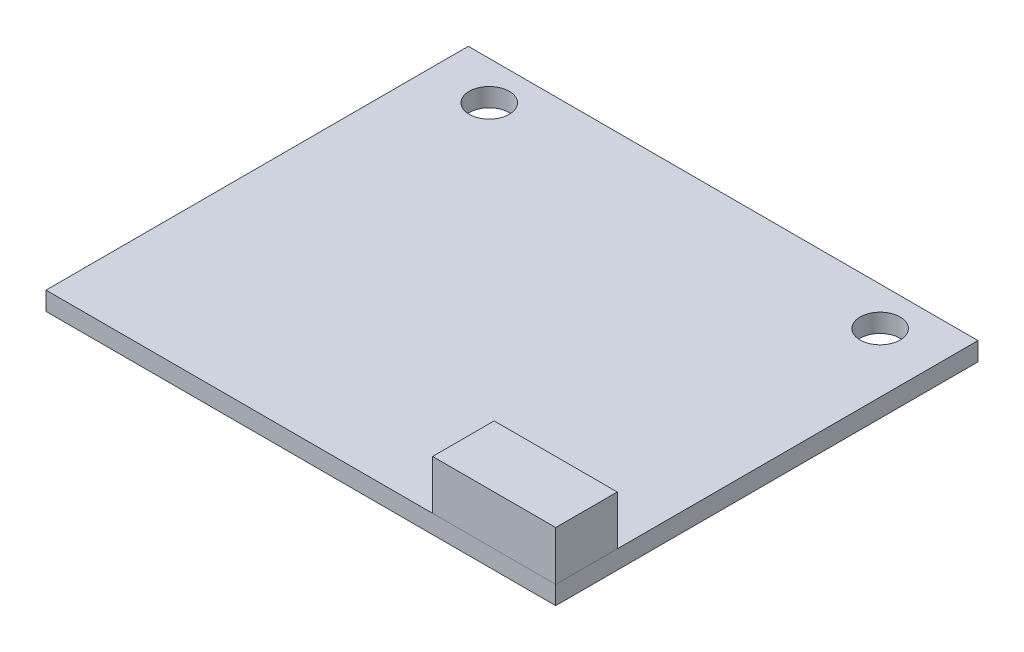
ISO-10303-21;
HEADER;
FILE_DESCRIPTION(('STEP AP214'),'2;1');
FILE_NAME('part.step','',(''),(''),'','','');
FILE_SCHEMA(('AUTOMOTIVE_DESIGN { 1 0 10303 214 1 1 1 1 }'));
ENDSEC;
DATA;
#1=APPLICATION_CONTEXT('core data for automotive mechanical design processes');
#2=APPLICATION_PROTOCOL_DEFINITION('international standard','automotive_design',2000,#1);
#3=PRODUCT_CONTEXT('',#1,'mechanical');
#4=PRODUCT('Part','Part','',(#3));
#5=PRODUCT_RELATED_PRODUCT_CATEGORY('part','',(#4));
#6=PRODUCT_DEFINITION_FORMATION('','',#4);
#7=PRODUCT_DEFINITION_CONTEXT('part definition',#1,'design');
#8=PRODUCT_DEFINITION('design','',#6,#7);
#9=PRODUCT_DEFINITION_SHAPE('','',#8);
#10=(LENGTH_UNIT() NAMED_UNIT(*) SI_UNIT(.MILLI.,.METRE.));
#11=(NAMED_UNIT(*) PLANE_ANGLE_UNIT() SI_UNIT($,.RADIAN.));
#12=(NAMED_UNIT(*) SI_UNIT($,.STERADIAN.) SOLID_ANGLE_UNIT());
#13=UNCERTAINTY_MEASURE_WITH_UNIT(LENGTH_MEASURE(1.E-05),#10,'distance_accuracy_value','');
#14=(GEOMETRIC_REPRESENTATION_CONTEXT(3) GLOBAL_UNCERTAINTY_ASSIGNED_CONTEXT((#13)) GLOBAL_UNIT_ASSIGNED_CONTEXT((#10,
#11,#12)) REPRESENTATION_CONTEXT('',''));
#15=CARTESIAN_POINT('',(0.,0.,0.));
#16=DIRECTION('',(0.,0.,1.));
#17=DIRECTION('',(1.,0.,0.));
#18=AXIS2_PLACEMENT_3D('',#15,#16,#17);
#19=CARTESIAN_POINT('',(20.7,5.5,17.15));
#20=DIRECTION('',(-1.,0.,0.));
#21=DIRECTION('',(0.,0.,1.));
#22=AXIS2_PLACEMENT_3D('',#19,#20,#21);
#23=PLANE('',#22);
#24=DIRECTION('',(0.,0.,-1.));
#25=VECTOR('',#24,1.);
#26=CARTESIAN_POINT('',(20.7,1.5,17.15));
#27=LINE('',#26,#25);
#28=CARTESIAN_POINT('',(20.7,1.5,17.15));
#29=VERTEX_POINT('',#28);
#30=CARTESIAN_POINT('',(20.7,1.5,12.15));
#31=VERTEX_POINT('',#30);
#32=EDGE_CURVE('E119',#29,#31,#27,.T.);
#33=ORIENTED_EDGE('',*,*,#32,.T.);
#34=DIRECTION('',(0.,-1.,0.));
#35=VECTOR('',#34,1.);
#36=CARTESIAN_POINT('',(20.7,5.5,12.15));
#37=LINE('',#36,#35);
#38=CARTESIAN_POINT('',(20.7,5.5,12.15));
#39=VERTEX_POINT('',#38);
#40=EDGE_CURVE('E12',#39,#31,#37,.T.);
#41=ORIENTED_EDGE('',*,*,#40,.F.);
#42=DIRECTION('',(0.,0.,-1.));
#43=VECTOR('',#42,1.);
#44=CARTESIAN_POINT('',(20.7,5.5,17.15));
#45=LINE('',#44,#43);
#46=CARTESIAN_POINT('',(20.7,5.5,17.15));
#47=VERTEX_POINT('',#46);
#48=EDGE_CURVE('E106',#47,#39,#45,.T.);
#49=ORIENTED_EDGE('',*,*,#48,.F.);
#50=DIRECTION('',(0.,-1.,0.));
#51=VECTOR('',#50,1.);
#52=CARTESIAN_POINT('',(20.7,5.5,17.15));
#53=LINE('',#52,#51);
#54=EDGE_CURVE('E111',#47,#29,#53,.T.);
#55=ORIENTED_EDGE('',*,*,#54,.T.);
#56=EDGE_LOOP('',(#33,#41,#49,#55));
#57=FACE_BOUND('',#56,.T.);
#58=ADVANCED_FACE('F54',(#57),#23,.F.);
#59=CARTESIAN_POINT('',(20.7,5.5,12.15));
#60=DIRECTION('',(0.,0.,1.));
#61=DIRECTION('',(1.,0.,0.));
#62=AXIS2_PLACEMENT_3D('',#59,#60,#61);
#63=PLANE('',#62);
#64=DIRECTION('',(-1.,0.,0.));
#65=VECTOR('',#64,1.);
#66=CARTESIAN_POINT('',(20.7,1.5,12.15));
#67=LINE('',#66,#65);
#68=CARTESIAN_POINT('',(10.7,1.5,12.15));
#69=VERTEX_POINT('',#68);
#70=EDGE_CURVE('E109',#31,#69,#67,.T.);
#71=ORIENTED_EDGE('',*,*,#70,.T.);
#72=DIRECTION('',(0.,-1.,0.));
#73=VECTOR('',#72,1.);
#74=CARTESIAN_POINT('',(10.7,5.5,12.15));
#75=LINE('',#74,#73);
#76=CARTESIAN_POINT('',(10.7,5.5,12.15));
#77=VERTEX_POINT('',#76);
#78=EDGE_CURVE('E64',#77,#69,#75,.T.);
#79=ORIENTED_EDGE('',*,*,#78,.F.);
#80=DIRECTION('',(-1.,0.,0.));
#81=VECTOR('',#80,1.);
#82=CARTESIAN_POINT('',(20.7,5.5,12.15));
#83=LINE('',#82,#81);
#84=EDGE_CURVE('E101',#39,#77,#83,.T.);
#85=ORIENTED_EDGE('',*,*,#84,.F.);
#86=ORIENTED_EDGE('',*,*,#40,.T.);
#87=EDGE_LOOP('',(#71,#79,#85,#86));
#88=FACE_BOUND('',#87,.T.);
#89=ADVANCED_FACE('F108',(#88),#63,.F.);
#90=CARTESIAN_POINT('',(10.7,5.5,17.15));
#91=DIRECTION('',(1.,0.,0.));
#92=DIRECTION('',(0.,0.,-1.));
#93=AXIS2_PLACEMENT_3D('',#90,#91,#92);
#94=PLANE('',#93);
#95=DIRECTION('',(0.,0.,1.));
#96=VECTOR('',#95,1.);
#97=CARTESIAN_POINT('',(10.7,1.5,17.15));
#98=LINE('',#97,#96);
#99=CARTESIAN_POINT('',(10.7,1.5,17.15));
#100=VERTEX_POINT('',#99);
#101=EDGE_CURVE('E86',#69,#100,#98,.T.);
#102=ORIENTED_EDGE('',*,*,#101,.T.);
#103=DIRECTION('',(0.,-1.,0.));
#104=VECTOR('',#103,1.);
#105=CARTESIAN_POINT('',(10.7,5.5,17.15));
#106=LINE('',#105,#104);
#107=CARTESIAN_POINT('',(10.7,5.5,17.15));
#108=VERTEX_POINT('',#107);
#109=EDGE_CURVE('E112',#108,#100,#106,.T.);
#110=ORIENTED_EDGE('',*,*,#109,.F.);
#111=DIRECTION('',(0.,0.,1.));
#112=VECTOR('',#111,1.);
#113=CARTESIAN_POINT('',(10.7,5.5,17.15));
#114=LINE('',#113,#112);
#115=EDGE_CURVE('E102',#77,#108,#114,.T.);
#116=ORIENTED_EDGE('',*,*,#115,.F.);
#117=ORIENTED_EDGE('',*,*,#78,.T.);
#118=EDGE_LOOP('',(#102,#110,#116,#117));
#119=FACE_BOUND('',#118,.T.);
#120=ADVANCED_FACE('F115',(#119),#94,.F.);
#121=CARTESIAN_POINT('',(20.7,5.5,17.15));
#122=DIRECTION('',(0.,0.,-1.));
#123=DIRECTION('',(-1.,0.,0.));
#124=AXIS2_PLACEMENT_3D('',#121,#122,#123);
#125=PLANE('',#124);
#126=DIRECTION('',(1.,0.,0.));
#127=VECTOR('',#126,1.);
#128=CARTESIAN_POINT('',(20.7,1.5,17.15));
#129=LINE('',#128,#127);
#130=EDGE_CURVE('E94',#100,#29,#129,.T.);
#131=ORIENTED_EDGE('',*,*,#130,.T.);
#132=ORIENTED_EDGE('',*,*,#54,.F.);
#133=DIRECTION('',(1.,0.,0.));
#134=VECTOR('',#133,1.);
#135=CARTESIAN_POINT('',(20.7,5.5,17.15));
#136=LINE('',#135,#134);
#137=EDGE_CURVE('E72',#108,#47,#136,.T.);
#138=ORIENTED_EDGE('',*,*,#137,.F.);
#139=ORIENTED_EDGE('',*,*,#109,.T.);
#140=EDGE_LOOP('',(#131,#132,#138,#139));
#141=FACE_BOUND('',#140,.T.);
#142=ADVANCED_FACE('F122',(#141),#125,.F.);
#143=CARTESIAN_POINT('',(0.,5.5,0.));
#144=DIRECTION('',(0.,1.,0.));
#145=DIRECTION('',(0.,0.,1.));
#146=AXIS2_PLACEMENT_3D('',#143,#144,#145);
#147=PLANE('',#146);
#148=ORIENTED_EDGE('',*,*,#48,.T.);
#149=ORIENTED_EDGE('',*,*,#84,.T.);
#150=ORIENTED_EDGE('',*,*,#115,.T.);
#151=ORIENTED_EDGE('',*,*,#137,.T.);
#152=EDGE_LOOP('',(#148,#149,#150,#151));
#153=FACE_BOUND('',#152,.T.);
#154=ADVANCED_FACE('F105',(#153),#147,.T.);
#155=CARTESIAN_POINT('',(0.,1.5,0.));
#156=DIRECTION('',(0.,1.,0.));
#157=DIRECTION('',(0.,0.,1.));
#158=AXIS2_PLACEMENT_3D('',#155,#156,#157);
#159=PLANE('',#158);
#160=ORIENTED_EDGE('',*,*,#32,.F.);
#161=ORIENTED_EDGE('',*,*,#130,.F.);
#162=ORIENTED_EDGE('',*,*,#101,.F.);
#163=ORIENTED_EDGE('',*,*,#70,.F.);
#164=EDGE_LOOP('',(#160,#161,#162,#163));
#165=FACE_BOUND('',#164,.T.);
#166=ADVANCED_FACE('F126',(#165),#159,.F.);
#167=CLOSED_SHELL('',(#58,#89,#120,#142,#154,#166));
#168=MANIFOLD_SOLID_BREP('B2',#167);
#169=CARTESIAN_POINT('',(0.,1.5,0.));
#170=DIRECTION('',(0.,1.,0.));
#171=DIRECTION('',(0.,0.,1.));
#172=AXIS2_PLACEMENT_3D('',#169,#170,#171);
#173=PLANE('',#172);
#174=CARTESIAN_POINT('',(-15.875,1.5,-14.025));
#175=DIRECTION('',(0.,1.,0.));
#176=DIRECTION('',(0.,0.,1.));
#177=AXIS2_PLACEMENT_3D('',#174,#175,#176);
#178=CIRCLE('',#177,1.625);
#179=CARTESIAN_POINT('',(-15.875,1.5,-12.4));
#180=VERTEX_POINT('',#179);
#181=EDGE_CURVE('E261',#180,#180,#178,.T.);
#182=ORIENTED_EDGE('',*,*,#181,.F.);
#183=EDGE_LOOP('',(#182));
#184=FACE_BOUND('',#183,.T.);
#185=DIRECTION('',(0.,0.,1.));
#186=VECTOR('',#185,1.);
#187=CARTESIAN_POINT('',(-20.7,1.5,-17.15));
#188=LINE('',#187,#186);
#189=CARTESIAN_POINT('',(-20.7,1.5,-17.15));
#190=VERTEX_POINT('',#189);
#191=CARTESIAN_POINT('',(-20.7,1.5,17.15));
#192=VERTEX_POINT('',#191);
#193=EDGE_CURVE('E238',#190,#192,#188,.T.);
#194=ORIENTED_EDGE('',*,*,#193,.T.);
#195=DIRECTION('',(1.,0.,0.));
#196=VECTOR('',#195,1.);
#197=CARTESIAN_POINT('',(-20.7,1.5,17.15));
#198=LINE('',#197,#196);
#199=CARTESIAN_POINT('',(20.7,1.5,17.15));
#200=VERTEX_POINT('',#199);
#201=EDGE_CURVE('E232',#192,#200,#198,.T.);
#202=ORIENTED_EDGE('',*,*,#201,.T.);
#203=DIRECTION('',(0.,0.,-1.));
#204=VECTOR('',#203,1.);
#205=CARTESIAN_POINT('',(20.7,1.5,-17.15));
#206=LINE('',#205,#204);
#207=CARTESIAN_POINT('',(20.7,1.5,-17.15));
#208=VERTEX_POINT('',#207);
#209=EDGE_CURVE('E236',#200,#208,#206,.T.);
#210=ORIENTED_EDGE('',*,*,#209,.T.);
#211=DIRECTION('',(-1.,0.,0.));
#212=VECTOR('',#211,1.);
#213=CARTESIAN_POINT('',(-20.7,1.5,-17.15));
#214=LINE('',#213,#212);
#215=EDGE_CURVE('E199',#208,#190,#214,.T.);
#216=ORIENTED_EDGE('',*,*,#215,.T.);
#217=EDGE_LOOP('',(#194,#202,#210,#216));
#218=FACE_BOUND('',#217,.T.);
#219=CARTESIAN_POINT('',(15.875,1.5,-14.025));
#220=DIRECTION('',(0.,1.,0.));
#221=DIRECTION('',(0.,0.,1.));
#222=AXIS2_PLACEMENT_3D('',#219,#220,#221);
#223=CIRCLE('',#222,1.625);
#224=CARTESIAN_POINT('',(15.875,1.5,-12.4));
#225=VERTEX_POINT('',#224);
#226=EDGE_CURVE('E285',#225,#225,#223,.T.);
#227=ORIENTED_EDGE('',*,*,#226,.F.);
#228=EDGE_LOOP('',(#227));
#229=FACE_BOUND('',#228,.T.);
#230=ADVANCED_FACE('F178',(#184,#218,#229),#173,.T.);
#231=CARTESIAN_POINT('',(0.,0.,0.));
#232=DIRECTION('',(0.,1.,0.));
#233=DIRECTION('',(0.,0.,1.));
#234=AXIS2_PLACEMENT_3D('',#231,#232,#233);
#235=PLANE('',#234);
#236=DIRECTION('',(0.,0.,1.));
#237=VECTOR('',#236,1.);
#238=CARTESIAN_POINT('',(-20.7,0.,-17.15));
#239=LINE('',#238,#237);
#240=CARTESIAN_POINT('',(-20.7,0.,-17.15));
#241=VERTEX_POINT('',#240);
#242=CARTESIAN_POINT('',(-20.7,0.,17.15));
#243=VERTEX_POINT('',#242);
#244=EDGE_CURVE('E260',#241,#243,#239,.T.);
#245=ORIENTED_EDGE('',*,*,#244,.F.);
#246=DIRECTION('',(-1.,0.,0.));
#247=VECTOR('',#246,1.);
#248=CARTESIAN_POINT('',(-20.7,0.,-17.15));
#249=LINE('',#248,#247);
#250=CARTESIAN_POINT('',(20.7,0.,-17.15));
#251=VERTEX_POINT('',#250);
#252=EDGE_CURVE('E230',#251,#241,#249,.T.);
#253=ORIENTED_EDGE('',*,*,#252,.F.);
#254=DIRECTION('',(0.,0.,-1.));
#255=VECTOR('',#254,1.);
#256=CARTESIAN_POINT('',(20.7,0.,-17.15));
#257=LINE('',#256,#255);
#258=CARTESIAN_POINT('',(20.7,0.,17.15));
#259=VERTEX_POINT('',#258);
#260=EDGE_CURVE('E219',#259,#251,#257,.T.);
#261=ORIENTED_EDGE('',*,*,#260,.F.);
#262=DIRECTION('',(1.,0.,0.));
#263=VECTOR('',#262,1.);
#264=CARTESIAN_POINT('',(-20.7,0.,17.15));
#265=LINE('',#264,#263);
#266=EDGE_CURVE('E243',#243,#259,#265,.T.);
#267=ORIENTED_EDGE('',*,*,#266,.F.);
#268=EDGE_LOOP('',(#245,#253,#261,#267));
#269=FACE_BOUND('',#268,.T.);
#270=CARTESIAN_POINT('',(-15.875,0.,-14.025));
#271=DIRECTION('',(0.,1.,0.));
#272=DIRECTION('',(0.,0.,1.));
#273=AXIS2_PLACEMENT_3D('',#270,#271,#272);
#274=CIRCLE('',#273,1.625);
#275=CARTESIAN_POINT('',(-15.875,0.,-12.4));
#276=VERTEX_POINT('',#275);
#277=EDGE_CURVE('E279',#276,#276,#274,.T.);
#278=ORIENTED_EDGE('',*,*,#277,.T.);
#279=EDGE_LOOP('',(#278));
#280=FACE_BOUND('',#279,.T.);
#281=CARTESIAN_POINT('',(15.875,0.,-14.025));
#282=DIRECTION('',(0.,1.,0.));
#283=DIRECTION('',(0.,0.,1.));
#284=AXIS2_PLACEMENT_3D('',#281,#282,#283);
#285=CIRCLE('',#284,1.625);
#286=CARTESIAN_POINT('',(15.875,0.,-12.4));
#287=VERTEX_POINT('',#286);
#288=EDGE_CURVE('E289',#287,#287,#285,.T.);
#289=ORIENTED_EDGE('',*,*,#288,.T.);
#290=EDGE_LOOP('',(#289));
#291=FACE_BOUND('',#290,.T.);
#292=ADVANCED_FACE('F272',(#269,#280,#291),#235,.F.);
#293=CARTESIAN_POINT('',(-20.7,1.5,-17.15));
#294=DIRECTION('',(1.,0.,0.));
#295=DIRECTION('',(0.,0.,-1.));
#296=AXIS2_PLACEMENT_3D('',#293,#294,#295);
#297=PLANE('',#296);
#298=ORIENTED_EDGE('',*,*,#244,.T.);
#299=DIRECTION('',(0.,-1.,0.));
#300=VECTOR('',#299,1.);
#301=CARTESIAN_POINT('',(-20.7,1.5,17.15));
#302=LINE('',#301,#300);
#303=EDGE_CURVE('E52',#192,#243,#302,.T.);
#304=ORIENTED_EDGE('',*,*,#303,.F.);
#305=ORIENTED_EDGE('',*,*,#193,.F.);
#306=DIRECTION('',(0.,-1.,0.));
#307=VECTOR('',#306,1.);
#308=CARTESIAN_POINT('',(-20.7,1.5,-17.15));
#309=LINE('',#308,#307);
#310=EDGE_CURVE('E251',#190,#241,#309,.T.);
#311=ORIENTED_EDGE('',*,*,#310,.T.);
#312=EDGE_LOOP('',(#298,#304,#305,#311));
#313=FACE_BOUND('',#312,.T.);
#314=ADVANCED_FACE('F182',(#313),#297,.F.);
#315=CARTESIAN_POINT('',(-20.7,1.5,17.15));
#316=DIRECTION('',(0.,0.,-1.));
#317=DIRECTION('',(-1.,0.,0.));
#318=AXIS2_PLACEMENT_3D('',#315,#316,#317);
#319=PLANE('',#318);
#320=ORIENTED_EDGE('',*,*,#266,.T.);
#321=DIRECTION('',(0.,-1.,0.));
#322=VECTOR('',#321,1.);
#323=CARTESIAN_POINT('',(20.7,1.5,17.15));
#324=LINE('',#323,#322);
#325=EDGE_CURVE('E186',#200,#259,#324,.T.);
#326=ORIENTED_EDGE('',*,*,#325,.F.);
#327=ORIENTED_EDGE('',*,*,#201,.F.);
#328=ORIENTED_EDGE('',*,*,#303,.T.);
#329=EDGE_LOOP('',(#320,#326,#327,#328));
#330=FACE_BOUND('',#329,.T.);
#331=ADVANCED_FACE('F241',(#330),#319,.F.);
#332=CARTESIAN_POINT('',(20.7,1.5,-17.15));
#333=DIRECTION('',(-1.,0.,0.));
#334=DIRECTION('',(0.,0.,1.));
#335=AXIS2_PLACEMENT_3D('',#332,#333,#334);
#336=PLANE('',#335);
#337=ORIENTED_EDGE('',*,*,#260,.T.);
#338=DIRECTION('',(0.,-1.,0.));
#339=VECTOR('',#338,1.);
#340=CARTESIAN_POINT('',(20.7,1.5,-17.15));
#341=LINE('',#340,#339);
#342=EDGE_CURVE('E246',#208,#251,#341,.T.);
#343=ORIENTED_EDGE('',*,*,#342,.F.);
#344=ORIENTED_EDGE('',*,*,#209,.F.);
#345=ORIENTED_EDGE('',*,*,#325,.T.);
#346=EDGE_LOOP('',(#337,#343,#344,#345));
#347=FACE_BOUND('',#346,.T.);
#348=ADVANCED_FACE('F250',(#347),#336,.F.);
#349=CARTESIAN_POINT('',(-20.7,1.5,-17.15));
#350=DIRECTION('',(0.,0.,1.));
#351=DIRECTION('',(1.,0.,0.));
#352=AXIS2_PLACEMENT_3D('',#349,#350,#351);
#353=PLANE('',#352);
#354=ORIENTED_EDGE('',*,*,#252,.T.);
#355=ORIENTED_EDGE('',*,*,#310,.F.);
#356=ORIENTED_EDGE('',*,*,#215,.F.);
#357=ORIENTED_EDGE('',*,*,#342,.T.);
#358=EDGE_LOOP('',(#354,#355,#356,#357));
#359=FACE_BOUND('',#358,.T.);
#360=ADVANCED_FACE('F269',(#359),#353,.F.);
#361=CARTESIAN_POINT('',(-15.875,1.5,-14.025));
#362=DIRECTION('',(0.,-1.,0.));
#363=DIRECTION('',(0.,0.,-1.));
#364=AXIS2_PLACEMENT_3D('',#361,#362,#363);
#365=CYLINDRICAL_SURFACE('',#364,1.625);
#366=ORIENTED_EDGE('',*,*,#181,.T.);
#367=EDGE_LOOP('',(#366));
#368=FACE_BOUND('',#367,.T.);
#369=ORIENTED_EDGE('',*,*,#277,.F.);
#370=EDGE_LOOP('',(#369));
#371=FACE_BOUND('',#370,.T.);
#372=ADVANCED_FACE('F302',(#368,#371),#365,.F.);
#373=CARTESIAN_POINT('',(15.875,1.5,-14.025));
#374=DIRECTION('',(0.,-1.,0.));
#375=DIRECTION('',(0.,0.,-1.));
#376=AXIS2_PLACEMENT_3D('',#373,#374,#375);
#377=CYLINDRICAL_SURFACE('',#376,1.625);
#378=ORIENTED_EDGE('',*,*,#226,.T.);
#379=EDGE_LOOP('',(#378));
#380=FACE_BOUND('',#379,.T.);
#381=ORIENTED_EDGE('',*,*,#288,.F.);
#382=EDGE_LOOP('',(#381));
#383=FACE_BOUND('',#382,.T.);
#384=ADVANCED_FACE('F294',(#380,#383),#377,.F.);
#385=CLOSED_SHELL('',(#230,#292,#314,#331,#348,#360,#372,#384));
#386=MANIFOLD_SOLID_BREP('B6',#385);
#387=ADVANCED_BREP_SHAPE_REPRESENTATION('',(#18,#168,#386),#14);
#388=SHAPE_DEFINITION_REPRESENTATION(#9,#387);
ENDSEC;
END-ISO-10303-21;
